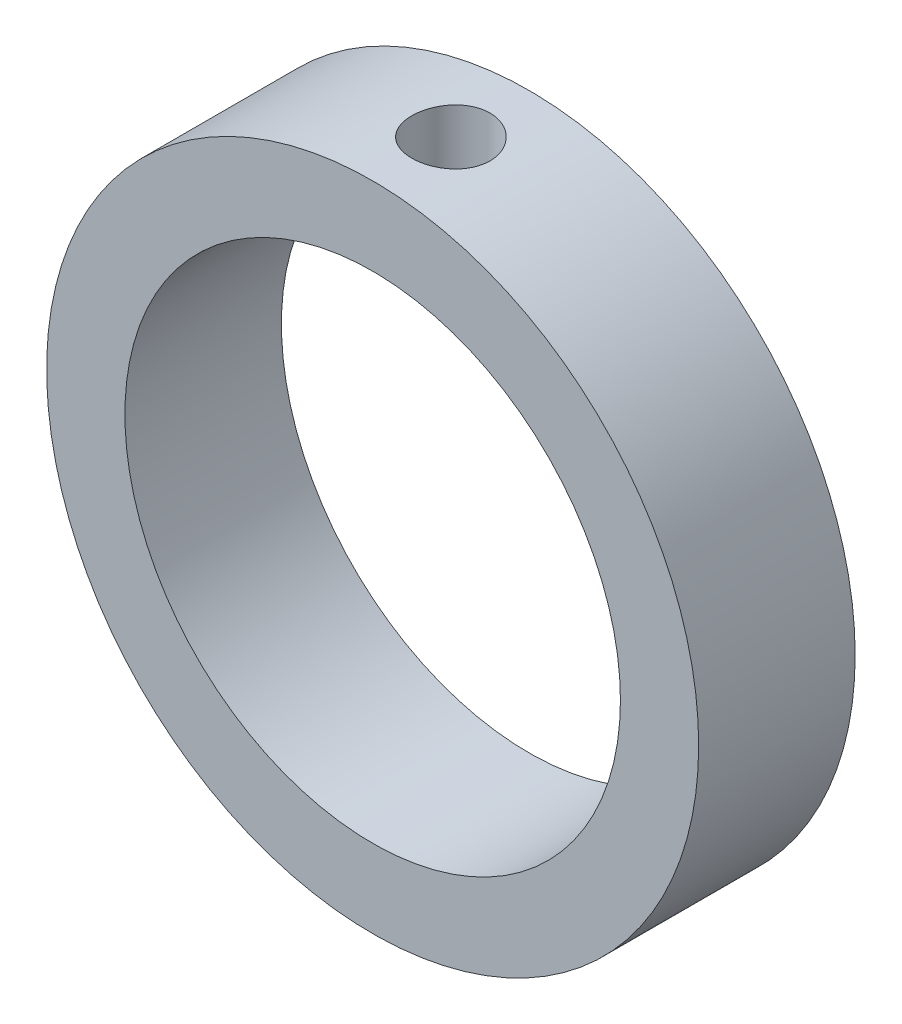
ISO-10303-21;
HEADER;
FILE_DESCRIPTION(('STEP AP214'),'2;1');
FILE_NAME('part.step','',(''),(''),'','','');
FILE_SCHEMA(('AUTOMOTIVE_DESIGN { 1 0 10303 214 1 1 1 1 }'));
ENDSEC;
DATA;
#1=APPLICATION_CONTEXT('core data for automotive mechanical design processes');
#2=APPLICATION_PROTOCOL_DEFINITION('international standard','automotive_design',2000,#1);
#3=PRODUCT_CONTEXT('',#1,'mechanical');
#4=PRODUCT('Part','Part','',(#3));
#5=PRODUCT_RELATED_PRODUCT_CATEGORY('part','',(#4));
#6=PRODUCT_DEFINITION_FORMATION('','',#4);
#7=PRODUCT_DEFINITION_CONTEXT('part definition',#1,'design');
#8=PRODUCT_DEFINITION('design','',#6,#7);
#9=PRODUCT_DEFINITION_SHAPE('','',#8);
#10=(LENGTH_UNIT() NAMED_UNIT(*) SI_UNIT(.MILLI.,.METRE.));
#11=(NAMED_UNIT(*) PLANE_ANGLE_UNIT() SI_UNIT($,.RADIAN.));
#12=(NAMED_UNIT(*) SI_UNIT($,.STERADIAN.) SOLID_ANGLE_UNIT());
#13=UNCERTAINTY_MEASURE_WITH_UNIT(LENGTH_MEASURE(1.E-05),#10,'distance_accuracy_value','');
#14=(GEOMETRIC_REPRESENTATION_CONTEXT(3) GLOBAL_UNCERTAINTY_ASSIGNED_CONTEXT((#13)) GLOBAL_UNIT_ASSIGNED_CONTEXT((#10,
#11,#12)) REPRESENTATION_CONTEXT('',''));
#15=CARTESIAN_POINT('',(0.,0.,0.));
#16=DIRECTION('',(0.,0.,1.));
#17=DIRECTION('',(1.,0.,0.));
#18=AXIS2_PLACEMENT_3D('',#15,#16,#17);
#19=CARTESIAN_POINT('',(0.,0.,3.));
#20=DIRECTION('',(0.,0.,-1.));
#21=DIRECTION('',(-1.,0.,0.));
#22=AXIS2_PLACEMENT_3D('',#19,#20,#21);
#23=CYLINDRICAL_SURFACE('',#22,12.5);
#24=CARTESIAN_POINT('',(0.,0.,3.));
#25=DIRECTION('',(0.,0.,1.));
#26=DIRECTION('',(1.,0.,0.));
#27=AXIS2_PLACEMENT_3D('',#24,#25,#26);
#28=CIRCLE('',#27,12.5);
#29=CARTESIAN_POINT('',(12.5,0.,3.));
#30=VERTEX_POINT('',#29);
#31=EDGE_CURVE('E10',#30,#30,#28,.T.);
#32=ORIENTED_EDGE('',*,*,#31,.F.);
#33=EDGE_LOOP('',(#32));
#34=FACE_BOUND('',#33,.T.);
#35=CARTESIAN_POINT('',(0.,0.,-3.));
#36=DIRECTION('',(0.,0.,1.));
#37=DIRECTION('',(1.,0.,0.));
#38=AXIS2_PLACEMENT_3D('',#35,#36,#37);
#39=CIRCLE('',#38,12.5);
#40=CARTESIAN_POINT('',(12.5,0.,-3.));
#41=VERTEX_POINT('',#40);
#42=EDGE_CURVE('E38',#41,#41,#39,.T.);
#43=ORIENTED_EDGE('',*,*,#42,.T.);
#44=EDGE_LOOP('',(#43));
#45=FACE_BOUND('',#44,.T.);
#46=CARTESIAN_POINT('',(0.,12.5,-1.5));
#47=CARTESIAN_POINT('',(0.0839320235538497,12.499998867873,-1.49999641802928));
#48=CARTESIAN_POINT('',(0.167917158665595,12.4991457100204,-1.49293167065366));
#49=CARTESIAN_POINT('',(0.333552285654125,12.495824352711,-1.46485946792231));
#50=CARTESIAN_POINT('',(0.415199714795034,12.4933544466864,-1.44383727937471));
#51=CARTESIAN_POINT('',(0.573737397670264,12.4870779632713,-1.38847686173699));
#52=CARTESIAN_POINT('',(0.650630743796124,12.4832722657654,-1.35414739658791));
#53=CARTESIAN_POINT('',(0.797549578916,12.4747479632173,-1.27316563245835));
#54=CARTESIAN_POINT('',(0.867576283567579,12.4700295202071,-1.22651552012334));
#55=CARTESIAN_POINT('',(0.999145657672256,12.460180052721,-1.12196256901238));
#56=CARTESIAN_POINT('',(1.0606483456536,12.4550472515452,-1.06400957994404));
#57=CARTESIAN_POINT('',(1.17307965519171,12.4449619698576,-0.938603517556051));
#58=CARTESIAN_POINT('',(1.22400774913237,12.4400094983534,-0.871149970490676));
#59=CARTESIAN_POINT('',(1.31399171436948,12.4308280185202,-0.728399587350809));
#60=CARTESIAN_POINT('',(1.35301037836285,12.4266012951985,-0.653079137709931));
#61=CARTESIAN_POINT('',(1.4178302865078,12.4193730672343,-0.496895648945627));
#62=CARTESIAN_POINT('',(1.44363199348388,12.4163715196899,-0.416032804015349));
#63=CARTESIAN_POINT('',(1.481164650227,12.4119503036869,-0.251473570344289));
#64=CARTESIAN_POINT('',(1.49296288993823,12.4105230726271,-0.167792735786162));
#65=CARTESIAN_POINT('',(1.50236187609835,12.4093888845306,0.000372468182082217));
#66=CARTESIAN_POINT('',(1.49996315026424,12.4096818635516,0.0848568076084829));
#67=CARTESIAN_POINT('',(1.48109158039334,12.4119480733153,0.251762982392175));
#68=CARTESIAN_POINT('',(1.46469271611151,12.4139124717338,0.334193319340089));
#69=CARTESIAN_POINT('',(1.41840173085033,12.4192864043804,0.49512351391068));
#70=CARTESIAN_POINT('',(1.38850935612907,12.4226959657844,0.573623297589498));
#71=CARTESIAN_POINT('',(1.31599990349931,12.4305861039738,0.724694734119557));
#72=CARTESIAN_POINT('',(1.27335053101962,12.4350693931099,0.797250739176777));
#73=CARTESIAN_POINT('',(1.17656086584735,12.444599699395,0.934203605457882));
#74=CARTESIAN_POINT('',(1.12242008861578,12.4496467403106,0.998600122451287));
#75=CARTESIAN_POINT('',(1.0037737778109,12.4597751654319,1.11783554218219));
#76=CARTESIAN_POINT('',(0.939204450256079,12.464856563712,1.17261098492853));
#77=CARTESIAN_POINT('',(0.80175397946936,12.4744510399275,1.27055576050015));
#78=CARTESIAN_POINT('',(0.728872819540023,12.478964116721,1.31372507000958));
#79=CARTESIAN_POINT('',(0.576819654131423,12.4869159430851,1.38723164281983));
#80=CARTESIAN_POINT('',(0.497645789357796,12.4903543736405,1.41756509666522));
#81=CARTESIAN_POINT('',(0.33527801113672,12.4957665326545,1.46448936892545));
#82=CARTESIAN_POINT('',(0.252084271220812,12.4977403242792,1.48108078000224));
#83=CARTESIAN_POINT('',(0.0845871981871083,12.4999926250152,1.49996812774885));
#84=CARTESIAN_POINT('',(0.000293860216025722,12.5002815046876,1.50235151620035));
#85=CARTESIAN_POINT('',(-0.16749103412163,12.4991593911616,1.49298571106587));
#86=CARTESIAN_POINT('',(-0.250982606163664,12.4977484312654,1.48123679435232));
#87=CARTESIAN_POINT('',(-0.414537131964178,12.4933916690343,1.44401251799845));
#88=CARTESIAN_POINT('',(-0.494609673184517,12.4904505118954,1.41857869347496));
#89=CARTESIAN_POINT('',(-0.64935269884323,12.4833627750896,1.35474964832321));
#90=CARTESIAN_POINT('',(-0.724023012961737,12.4792161574379,1.31635401925496));
#91=CARTESIAN_POINT('',(-0.866233588832522,12.4701542579347,1.22747854204879));
#92=CARTESIAN_POINT('',(-0.933738144813755,12.4652354042322,1.17694193109459));
#93=CARTESIAN_POINT('',(-1.05933812576102,12.455190895971,1.06529957679591));
#94=CARTESIAN_POINT('',(-1.11743320736475,12.4500652338742,1.00419344792602));
#95=CARTESIAN_POINT('',(-1.22287397613077,12.4401529742471,0.872762192286156));
#96=CARTESIAN_POINT('',(-1.2701618161597,12.4353682915654,0.802390492328075));
#97=CARTESIAN_POINT('',(-1.35224657214666,12.4267107496692,0.65465248746222));
#98=CARTESIAN_POINT('',(-1.38704372178037,12.4228378733971,0.577286313440878));
#99=CARTESIAN_POINT('',(-1.44306498334079,12.4164552867251,0.417944695552653));
#100=CARTESIAN_POINT('',(-1.46432210079673,12.4139422637816,0.335980994070305));
#101=CARTESIAN_POINT('',(-1.49276636081758,12.4105542637293,0.169615515257466));
#102=CARTESIAN_POINT('',(-1.49995410263041,12.4096792168553,0.085213841921337));
#103=CARTESIAN_POINT('',(-1.50004516908965,12.4096681633035,-0.0830563648185869));
#104=CARTESIAN_POINT('',(-1.49303936835675,12.4105210931972,-0.166924862885633));
#105=CARTESIAN_POINT('',(-1.46513424336044,12.4138461473713,-0.332283393197084));
#106=CARTESIAN_POINT('',(-1.44423491411034,12.4163182722328,-0.413773424587793));
#107=CARTESIAN_POINT('',(-1.38916369910273,12.4225998262293,-0.572052269444348));
#108=CARTESIAN_POINT('',(-1.35499582785269,12.4264088508406,-0.648842496747742));
#109=CARTESIAN_POINT('',(-1.27436641314005,12.4349357269569,-0.79561387353505));
#110=CARTESIAN_POINT('',(-1.22790476354723,12.4396535863076,-0.865594964229653));
#111=CARTESIAN_POINT('',(-1.12366844823603,12.4495027561294,-0.997226470054419));
#112=CARTESIAN_POINT('',(-1.06582601965075,12.4546364290673,-1.05882305163314));
#113=CARTESIAN_POINT('',(-0.940610466672237,12.4647177484085,-1.171471239783));
#114=CARTESIAN_POINT('',(-0.873235091318004,12.4696653505255,-1.2225203488146));
#115=CARTESIAN_POINT('',(-0.730596612325683,12.4788360854662,-1.31277528899943));
#116=CARTESIAN_POINT('',(-0.655306617312087,12.4830566108105,-1.35193886286114));
#117=CARTESIAN_POINT('',(-0.499211375842655,12.4902709259863,-1.41701188222129));
#118=CARTESIAN_POINT('',(-0.418412282181072,12.4932660590307,-1.44293584809019));
#119=CARTESIAN_POINT('',(-0.280988550618348,12.4969634163,-1.47453171016906));
#120=CARTESIAN_POINT('',(-0.225233284876744,12.4980966397165,-1.48406874194319));
#121=CARTESIAN_POINT('',(-0.112993367846847,12.4996153102102,-1.49680407174548));
#122=CARTESIAN_POINT('',(-0.0565087213768126,12.5000007622246,-1.50000241162523));
#123=CARTESIAN_POINT('',(0.,12.5,-1.5));
#124=B_SPLINE_CURVE_WITH_KNOTS('',3,(#46,#47,#48,#49,#50,#51,#52,#53,#54,#55,#56,#57,#58,#59,
#60,#61,#62,#63,#64,#65,#66,#67,#68,#69,#70,#71,#72,#73,#74,#75,#76,#77,#78,#79,#80,#81,#82,#83,
#84,#85,#86,#87,#88,#89,#90,#91,#92,#93,#94,#95,#96,#97,#98,#99,#100,#101,#102,#103,#104,#105,
#106,#107,#108,#109,#110,#111,#112,#113,#114,#115,#116,#117,#118,#119,#120,#121,#122,#123),
.UNSPECIFIED.,.T.,.F.,(4,2,2,2,2,2,2,2,2,2,2,2,2,2,2,2,2,2,2,2,2,2,2,2,2,2,2,2,2,2,2,2,2,2,2,2,
2,2,4),(0.,0.25158967547808,0.503445347043117,0.7551354318778,1.00678087720846,1.25956936097939,
1.51237045452442,1.76595344748199,2.01952755999557,2.27187819171639,2.5242194433424,
2.77523546456126,3.02625620626698,3.27791786855268,3.52959014434631,3.78286472320158,
4.036139810863,4.28949001347139,4.54282928911309,4.79460761312113,5.04638100450539,
5.29739451278874,5.54841593150834,5.80063460892782,6.05286248801782,6.30641037908359,
6.55995352653149,6.81287624132444,7.06578818330771,7.31708596596146,7.56838383881169,
7.81960573856942,8.07082980715607,8.3235976201016,8.57642521760045,8.83014145119729,
9.08357882396374,9.25296714728134,9.42235435219904),.UNSPECIFIED.);
#125=CARTESIAN_POINT('',(0.,12.5,-1.5));
#126=VERTEX_POINT('',#125);
#127=EDGE_CURVE('E53',#126,#126,#124,.T.);
#128=ORIENTED_EDGE('',*,*,#127,.T.);
#129=EDGE_LOOP('',(#128));
#130=FACE_BOUND('',#129,.T.);
#131=ADVANCED_FACE('F35',(#34,#45,#130),#23,.T.);
#132=CARTESIAN_POINT('',(0.,0.,3.));
#133=DIRECTION('',(0.,0.,-1.));
#134=DIRECTION('',(-1.,0.,0.));
#135=AXIS2_PLACEMENT_3D('',#132,#133,#134);
#136=CYLINDRICAL_SURFACE('',#135,9.5);
#137=CARTESIAN_POINT('',(0.,0.,-3.));
#138=DIRECTION('',(0.,0.,1.));
#139=DIRECTION('',(1.,0.,0.));
#140=AXIS2_PLACEMENT_3D('',#137,#138,#139);
#141=CIRCLE('',#140,9.5);
#142=CARTESIAN_POINT('',(9.5,0.,-3.));
#143=VERTEX_POINT('',#142);
#144=EDGE_CURVE('E47',#143,#143,#141,.T.);
#145=ORIENTED_EDGE('',*,*,#144,.F.);
#146=EDGE_LOOP('',(#145));
#147=FACE_BOUND('',#146,.T.);
#148=CARTESIAN_POINT('',(0.,0.,3.));
#149=DIRECTION('',(0.,0.,1.));
#150=DIRECTION('',(1.,0.,0.));
#151=AXIS2_PLACEMENT_3D('',#148,#149,#150);
#152=CIRCLE('',#151,9.5);
#153=CARTESIAN_POINT('',(9.5,0.,3.));
#154=VERTEX_POINT('',#153);
#155=EDGE_CURVE('E45',#154,#154,#152,.T.);
#156=ORIENTED_EDGE('',*,*,#155,.T.);
#157=EDGE_LOOP('',(#156));
#158=FACE_BOUND('',#157,.T.);
#159=CARTESIAN_POINT('',(0.,9.5,-1.5));
#160=CARTESIAN_POINT('',(0.0836976001065212,9.49999861203618,-1.49999659075089));
#161=CARTESIAN_POINT('',(0.167442437394015,9.49888234231911,-1.49297105489717));
#162=CARTESIAN_POINT('',(0.332587635211273,9.49453678011783,-1.46506375653031));
#163=CARTESIAN_POINT('',(0.41398569489526,9.49130548294469,-1.44416884792844));
#164=CARTESIAN_POINT('',(0.572023766729428,9.48309267200424,-1.38916582150304));
#165=CARTESIAN_POINT('',(0.648667457404599,9.47811253172855,-1.35506807066557));
#166=CARTESIAN_POINT('',(0.795134710469113,9.46695108120927,-1.27465345446147));
#167=CARTESIAN_POINT('',(0.864959141108909,9.46076992418342,-1.22833814746046));
#168=CARTESIAN_POINT('',(0.996418466512017,9.44783324384052,-1.12437811450022));
#169=CARTESIAN_POINT('',(1.05798606000114,9.44107365911176,-1.06664878123631));
#170=CARTESIAN_POINT('',(1.17060304704613,9.42777343334239,-0.941681518294072));
#171=CARTESIAN_POINT('',(1.22165180906462,9.42123280546741,-0.874443018105818));
#172=CARTESIAN_POINT('',(1.31204764005015,9.40907168619827,-0.731909155530542));
#173=CARTESIAN_POINT('',(1.35132892424659,9.40345644380092,-0.656571585240804));
#174=CARTESIAN_POINT('',(1.41665421811941,9.39383775862892,-0.500264325212042));
#175=CARTESIAN_POINT('',(1.44269902834657,9.38983421838048,-0.419294976423554));
#176=CARTESIAN_POINT('',(1.4806016253586,9.38393240557449,-0.254733051048338));
#177=CARTESIAN_POINT('',(1.49257509267669,9.38201697623701,-0.17116774521641));
#178=CARTESIAN_POINT('',(1.50235362805524,9.38045626095234,-0.00319382694182294));
#179=CARTESIAN_POINT('',(1.50015959652364,9.38081083073655,0.0812147315679284));
#180=CARTESIAN_POINT('',(1.48175980710843,9.38373437383502,0.247657971556181));
#181=CARTESIAN_POINT('',(1.46568339888114,9.38628290415411,0.329707363291588));
#182=CARTESIAN_POINT('',(1.4201779253579,9.39327524902392,0.489929396074079));
#183=CARTESIAN_POINT('',(1.39074844516594,9.39771912246498,0.568101916578385));
#184=CARTESIAN_POINT('',(1.3192392577636,9.40802379337809,0.718741812749192));
#185=CARTESIAN_POINT('',(1.27710525865785,9.41389065039576,0.791182984381052));
#186=CARTESIAN_POINT('',(1.1814216728908,9.42637594353948,0.928016052090479));
#187=CARTESIAN_POINT('',(1.12787125747699,9.43299443421261,0.992407363265467));
#188=CARTESIAN_POINT('',(1.01016734202821,9.44632735425788,1.11206211659932));
#189=CARTESIAN_POINT('',(0.945902736525759,9.45304203303564,1.16721629546965));
#190=CARTESIAN_POINT('',(0.808972007834444,9.46574266984972,1.26597392142834));
#191=CARTESIAN_POINT('',(0.73630584030216,9.47172862403949,1.30957730754764));
#192=CARTESIAN_POINT('',(0.584536306884603,9.48230461469925,1.38400321375013));
#193=CARTESIAN_POINT('',(0.505428458120266,9.48689366833474,1.4148167406315));
#194=CARTESIAN_POINT('',(0.343072096390924,9.49415073946819,1.46269030700213));
#195=CARTESIAN_POINT('',(0.259823894418548,9.49681890101704,1.47975137782244));
#196=CARTESIAN_POINT('',(0.0924923680310956,9.49991434597553,1.4994891369157));
#197=CARTESIAN_POINT('',(0.00842716740136869,9.50036501369999,1.50231593842445));
#198=CARTESIAN_POINT('',(-0.158976265712539,9.49903852875433,1.49390417515635));
#199=CARTESIAN_POINT('',(-0.242314523112228,9.4972614527432,1.48266609436678));
#200=CARTESIAN_POINT('',(-0.405439567370637,9.49169362069365,1.44656841868431));
#201=CARTESIAN_POINT('',(-0.48524306279508,9.48791376028194,1.42178250442077));
#202=CARTESIAN_POINT('',(-0.639561861197124,9.47876264558505,1.35937083242702));
#203=CARTESIAN_POINT('',(-0.714076892756962,9.4733913096943,1.32174441626356));
#204=CARTESIAN_POINT('',(-0.856359938682377,9.4615955819989,1.2343715048895));
#205=CARTESIAN_POINT('',(-0.92406920731113,9.45516310943481,1.18453045621265));
#206=CARTESIAN_POINT('',(-1.05021609132263,9.44198475905152,1.07427399741095));
#207=CARTESIAN_POINT('',(-1.10865310573566,9.43523886095462,1.01385790241082));
#208=CARTESIAN_POINT('',(-1.21514760920431,9.42211913600069,0.883495734437124));
#209=CARTESIAN_POINT('',(-1.26310409838576,9.41574932753235,0.81346668641198));
#210=CARTESIAN_POINT('',(-1.34657266649327,9.40417594303638,0.666258687733926));
#211=CARTESIAN_POINT('',(-1.38208510941917,9.39897233289797,0.589079946299656));
#212=CARTESIAN_POINT('',(-1.43950349612766,9.39035010587674,0.43005588906143));
#213=CARTESIAN_POINT('',(-1.46146126125825,9.38692469878068,0.348229668837615));
#214=CARTESIAN_POINT('',(-1.49131110199775,9.38222912838246,0.181992332759652));
#215=CARTESIAN_POINT('',(-1.49920426388363,9.38095879863367,0.0975814170462393));
#216=CARTESIAN_POINT('',(-1.5006729373316,9.38072387634563,-0.0704216729911092));
#217=CARTESIAN_POINT('',(-1.49440732883688,9.38173369742788,-0.154012465580479));
#218=CARTESIAN_POINT('',(-1.46807821019621,9.38588947240367,-0.318935133020526));
#219=CARTESIAN_POINT('',(-1.44801473210917,9.38903542133398,-0.400267013119255));
#220=CARTESIAN_POINT('',(-1.39471776903661,9.39709967714348,-0.558311064845609));
#221=CARTESIAN_POINT('',(-1.3614965806929,9.40201632881049,-0.635027473007638));
#222=CARTESIAN_POINT('',(-1.28284324745908,9.41306982252277,-0.781823568325396));
#223=CARTESIAN_POINT('',(-1.23741059974182,9.41920671481075,-0.851902982031103));
#224=CARTESIAN_POINT('',(-1.13505145080215,9.4320909582884,-0.984240968062915));
#225=CARTESIAN_POINT('',(-1.0780076272868,9.43884411780419,-1.04640824158857));
#226=CARTESIAN_POINT('',(-0.954293245344262,9.45215249855795,-1.16034348055255));
#227=CARTESIAN_POINT('',(-0.887620460616887,9.45870767359521,-1.21210903438498));
#228=CARTESIAN_POINT('',(-0.746056649485085,9.47092780190555,-1.3040585652105));
#229=CARTESIAN_POINT('',(-0.671117681090889,9.47658704267683,-1.34416948717269));
#230=CARTESIAN_POINT('',(-0.515509688205493,9.48632189921254,-1.41117359654583));
#231=CARTESIAN_POINT('',(-0.434846589899645,9.49039912533837,-1.43808023226726));
#232=CARTESIAN_POINT('',(-0.294869549677869,9.4955986667772,-1.4719290910522));
#233=CARTESIAN_POINT('',(-0.236411965071404,9.49724053176745,-1.48243924191617));
#234=CARTESIAN_POINT('',(-0.118644158414181,9.49944168248486,-1.49647585408426));
#235=CARTESIAN_POINT('',(-0.0593339487629794,9.50000098393949,-1.50000241684602));
#236=CARTESIAN_POINT('',(0.,9.5,-1.5));
#237=B_SPLINE_CURVE_WITH_KNOTS('',3,(#159,#160,#161,#162,#163,#164,#165,#166,#167,#168,#169,
#170,#171,#172,#173,#174,#175,#176,#177,#178,#179,#180,#181,#182,#183,#184,#185,#186,#187,#188,
#189,#190,#191,#192,#193,#194,#195,#196,#197,#198,#199,#200,#201,#202,#203,#204,#205,#206,#207,
#208,#209,#210,#211,#212,#213,#214,#215,#216,#217,#218,#219,#220,#221,#222,#223,#224,#225,#226,
#227,#228,#229,#230,#231,#232,#233,#234,#235,#236),.UNSPECIFIED.,.T.,.F.,(4,2,2,2,2,2,2,2,2,2,2,
2,2,2,2,2,2,2,2,2,2,2,2,2,2,2,2,2,2,2,2,2,2,2,2,2,2,2,4),(0.,0.250875955706267,
0.501990044469083,0.752907354824666,1.00379267580462,1.25661257446513,1.50944764769345,
1.76367086508286,2.0178787050521,2.26998174901985,2.52206877086913,2.77183199835411,
3.02160298681438,3.27245685757923,3.52332894479686,3.77698595667627,4.03064430741767,
4.28448071735229,4.53829808968867,4.78943303847652,5.0405593456862,5.2903332848928,
5.54012003389346,5.79190509693548,6.04370647245533,6.2978367744557,6.55195964228958,
6.80510484781958,7.05823050087969,7.30852987505233,7.55882866766463,7.80889409144677,
8.05896981366678,8.31171040651354,8.56450952903007,8.81886068521234,9.07295224922779,
9.25080295634069,9.42865107961775),.UNSPECIFIED.);
#238=CARTESIAN_POINT('',(0.,9.5,-1.5));
#239=VERTEX_POINT('',#238);
#240=EDGE_CURVE('E50',#239,#239,#237,.T.);
#241=ORIENTED_EDGE('',*,*,#240,.F.);
#242=EDGE_LOOP('',(#241));
#243=FACE_BOUND('',#242,.T.);
#244=ADVANCED_FACE('F73',(#147,#158,#243),#136,.F.);
#245=CARTESIAN_POINT('',(0.,0.,3.));
#246=DIRECTION('',(0.,0.,1.));
#247=DIRECTION('',(1.,0.,0.));
#248=AXIS2_PLACEMENT_3D('',#245,#246,#247);
#249=PLANE('',#248);
#250=ORIENTED_EDGE('',*,*,#31,.T.);
#251=EDGE_LOOP('',(#250));
#252=FACE_BOUND('',#251,.T.);
#253=ORIENTED_EDGE('',*,*,#155,.F.);
#254=EDGE_LOOP('',(#253));
#255=FACE_BOUND('',#254,.T.);
#256=ADVANCED_FACE('F77',(#252,#255),#249,.T.);
#257=CARTESIAN_POINT('',(0.,0.,-3.));
#258=DIRECTION('',(0.,0.,1.));
#259=DIRECTION('',(1.,0.,0.));
#260=AXIS2_PLACEMENT_3D('',#257,#258,#259);
#261=PLANE('',#260);
#262=ORIENTED_EDGE('',*,*,#42,.F.);
#263=EDGE_LOOP('',(#262));
#264=FACE_BOUND('',#263,.T.);
#265=ORIENTED_EDGE('',*,*,#144,.T.);
#266=EDGE_LOOP('',(#265));
#267=FACE_BOUND('',#266,.T.);
#268=ADVANCED_FACE('F71',(#264,#267),#261,.F.);
#269=CARTESIAN_POINT('',(0.,12.501,0.));
#270=DIRECTION('',(0.,-1.,0.));
#271=DIRECTION('',(0.,0.,-1.));
#272=AXIS2_PLACEMENT_3D('',#269,#270,#271);
#273=CYLINDRICAL_SURFACE('',#272,1.5);
#274=ORIENTED_EDGE('',*,*,#240,.T.);
#275=EDGE_LOOP('',(#274));
#276=FACE_BOUND('',#275,.T.);
#277=ORIENTED_EDGE('',*,*,#127,.F.);
#278=EDGE_LOOP('',(#277));
#279=FACE_BOUND('',#278,.T.);
#280=ADVANCED_FACE('F65',(#276,#279),#273,.F.);
#281=CLOSED_SHELL('',(#131,#244,#256,#268,#280));
#282=MANIFOLD_SOLID_BREP('B2',#281);
#283=ADVANCED_BREP_SHAPE_REPRESENTATION('',(#18,#282),#14);
#284=SHAPE_DEFINITION_REPRESENTATION(#9,#283);
ENDSEC;
END-ISO-10303-21;
